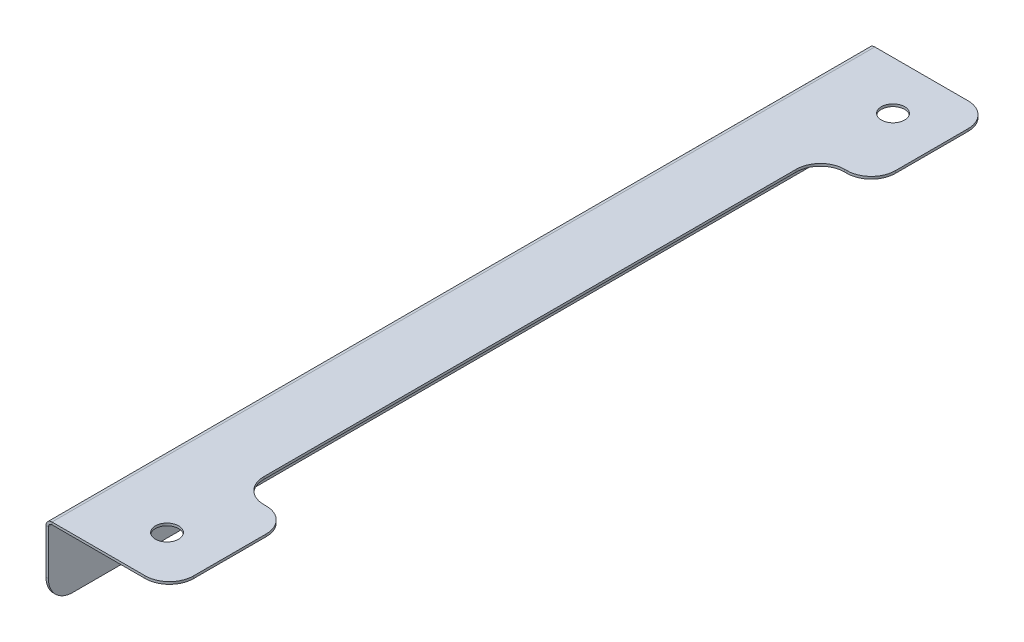
ISO-10303-21;
HEADER;
FILE_DESCRIPTION(('STEP AP214'),'2;1');
FILE_NAME('part.step','',(''),(''),'','','');
FILE_SCHEMA(('AUTOMOTIVE_DESIGN { 1 0 10303 214 1 1 1 1 }'));
ENDSEC;
DATA;
#1=APPLICATION_CONTEXT('core data for automotive mechanical design processes');
#2=APPLICATION_PROTOCOL_DEFINITION('international standard','automotive_design',2000,#1);
#3=PRODUCT_CONTEXT('',#1,'mechanical');
#4=PRODUCT('Part','Part','',(#3));
#5=PRODUCT_RELATED_PRODUCT_CATEGORY('part','',(#4));
#6=PRODUCT_DEFINITION_FORMATION('','',#4);
#7=PRODUCT_DEFINITION_CONTEXT('part definition',#1,'design');
#8=PRODUCT_DEFINITION('design','',#6,#7);
#9=PRODUCT_DEFINITION_SHAPE('','',#8);
#10=(LENGTH_UNIT() NAMED_UNIT(*) SI_UNIT(.MILLI.,.METRE.));
#11=(NAMED_UNIT(*) PLANE_ANGLE_UNIT() SI_UNIT($,.RADIAN.));
#12=(NAMED_UNIT(*) SI_UNIT($,.STERADIAN.) SOLID_ANGLE_UNIT());
#13=UNCERTAINTY_MEASURE_WITH_UNIT(LENGTH_MEASURE(1.E-05),#10,'distance_accuracy_value','');
#14=(GEOMETRIC_REPRESENTATION_CONTEXT(3) GLOBAL_UNCERTAINTY_ASSIGNED_CONTEXT((#13)) GLOBAL_UNIT_ASSIGNED_CONTEXT((#10,
#11,#12)) REPRESENTATION_CONTEXT('',''));
#15=CARTESIAN_POINT('',(0.,0.,0.));
#16=DIRECTION('',(0.,0.,1.));
#17=DIRECTION('',(1.,0.,0.));
#18=AXIS2_PLACEMENT_3D('',#15,#16,#17);
#19=CARTESIAN_POINT('',(25.,8.00000000000009,-85.));
#20=DIRECTION('',(-1.,0.,0.));
#21=DIRECTION('',(0.,-1.,0.));
#22=AXIS2_PLACEMENT_3D('',#19,#20,#21);
#23=PLANE('',#22);
#24=DIRECTION('',(0.,0.,-1.));
#25=VECTOR('',#24,1.);
#26=CARTESIAN_POINT('',(25.,8.00000000000009,-85.));
#27=LINE('',#26,#25);
#28=CARTESIAN_POINT('',(25.,8.00000000000009,80.));
#29=VERTEX_POINT('',#28);
#30=CARTESIAN_POINT('',(25.,8.00000000000009,65.));
#31=VERTEX_POINT('',#30);
#32=EDGE_CURVE('E215',#29,#31,#27,.T.);
#33=ORIENTED_EDGE('',*,*,#32,.F.);
#34=DIRECTION('',(0.,-1.,0.));
#35=VECTOR('',#34,1.);
#36=CARTESIAN_POINT('',(25.,8.00000000000009,80.));
#37=LINE('',#36,#35);
#38=CARTESIAN_POINT('',(25.,7.50000000000009,80.));
#39=VERTEX_POINT('',#38);
#40=EDGE_CURVE('E271',#29,#39,#37,.T.);
#41=ORIENTED_EDGE('',*,*,#40,.T.);
#42=DIRECTION('',(0.,0.,-1.));
#43=VECTOR('',#42,1.);
#44=CARTESIAN_POINT('',(25.,7.50000000000009,-85.));
#45=LINE('',#44,#43);
#46=CARTESIAN_POINT('',(25.,7.50000000000009,65.));
#47=VERTEX_POINT('',#46);
#48=EDGE_CURVE('E217',#39,#47,#45,.T.);
#49=ORIENTED_EDGE('',*,*,#48,.T.);
#50=DIRECTION('',(0.,1.,0.));
#51=VECTOR('',#50,1.);
#52=CARTESIAN_POINT('',(25.,8.00000000000009,65.));
#53=LINE('',#52,#51);
#54=EDGE_CURVE('E268',#47,#31,#53,.T.);
#55=ORIENTED_EDGE('',*,*,#54,.T.);
#56=EDGE_LOOP('',(#33,#41,#49,#55));
#57=FACE_BOUND('',#56,.T.);
#58=ADVANCED_FACE('F37',(#57),#23,.F.);
#59=CARTESIAN_POINT('',(-0.5,-7.5,85.));
#60=DIRECTION('',(0.,0.,1.));
#61=DIRECTION('',(1.,0.,0.));
#62=AXIS2_PLACEMENT_3D('',#59,#60,#61);
#63=PLANE('',#62);
#64=DIRECTION('',(0.,-1.,0.));
#65=VECTOR('',#64,1.);
#66=CARTESIAN_POINT('',(-0.5,-7.5,85.));
#67=LINE('',#66,#65);
#68=CARTESIAN_POINT('',(-0.499999999999997,6.7634,85.));
#69=VERTEX_POINT('',#68);
#70=CARTESIAN_POINT('',(-0.5,-2.5,85.));
#71=VERTEX_POINT('',#70);
#72=EDGE_CURVE('E243',#69,#71,#67,.T.);
#73=ORIENTED_EDGE('',*,*,#72,.T.);
#74=DIRECTION('',(1.,0.,0.));
#75=VECTOR('',#74,1.);
#76=CARTESIAN_POINT('',(-0.5,-2.5,85.));
#77=LINE('',#76,#75);
#78=CARTESIAN_POINT('',(0.,-2.5,85.));
#79=VERTEX_POINT('',#78);
#80=EDGE_CURVE('E320',#71,#79,#77,.T.);
#81=ORIENTED_EDGE('',*,*,#80,.T.);
#82=DIRECTION('',(0.,-1.,0.));
#83=VECTOR('',#82,1.);
#84=CARTESIAN_POINT('',(0.,-7.5,85.));
#85=LINE('',#84,#83);
#86=CARTESIAN_POINT('',(0.,6.7634,85.));
#87=VERTEX_POINT('',#86);
#88=EDGE_CURVE('E252',#87,#79,#85,.T.);
#89=ORIENTED_EDGE('',*,*,#88,.F.);
#90=DIRECTION('',(-1.,0.,0.));
#91=VECTOR('',#90,1.);
#92=CARTESIAN_POINT('',(0.,6.7634,85.));
#93=LINE('',#92,#91);
#94=EDGE_CURVE('E228',#87,#69,#93,.T.);
#95=ORIENTED_EDGE('',*,*,#94,.T.);
#96=EDGE_LOOP('',(#73,#81,#89,#95));
#97=FACE_BOUND('',#96,.T.);
#98=ADVANCED_FACE('F401',(#97),#63,.T.);
#99=CARTESIAN_POINT('',(-0.5,0.,0.));
#100=DIRECTION('',(-1.,0.,0.));
#101=DIRECTION('',(0.,0.,1.));
#102=AXIS2_PLACEMENT_3D('',#99,#100,#101);
#103=PLANE('',#102);
#104=CARTESIAN_POINT('',(-0.5,0.,60.));
#105=DIRECTION('',(1.,0.,0.));
#106=DIRECTION('',(0.,0.,-1.));
#107=AXIS2_PLACEMENT_3D('',#104,#105,#106);
#108=CIRCLE('',#107,2.4);
#109=CARTESIAN_POINT('',(-0.5,0.,57.6));
#110=VERTEX_POINT('',#109);
#111=EDGE_CURVE('E454',#110,#110,#108,.T.);
#112=ORIENTED_EDGE('',*,*,#111,.T.);
#113=EDGE_LOOP('',(#112));
#114=FACE_BOUND('',#113,.T.);
#115=CARTESIAN_POINT('',(-0.5,0.,0.));
#116=DIRECTION('',(1.,0.,0.));
#117=DIRECTION('',(0.,0.,-1.));
#118=AXIS2_PLACEMENT_3D('',#115,#116,#117);
#119=CIRCLE('',#118,2.4);
#120=CARTESIAN_POINT('',(-0.5,0.,-2.4));
#121=VERTEX_POINT('',#120);
#122=EDGE_CURVE('E448',#121,#121,#119,.T.);
#123=ORIENTED_EDGE('',*,*,#122,.T.);
#124=EDGE_LOOP('',(#123));
#125=FACE_BOUND('',#124,.T.);
#126=CARTESIAN_POINT('',(-0.5,0.,-60.));
#127=DIRECTION('',(1.,0.,0.));
#128=DIRECTION('',(0.,0.,-1.));
#129=AXIS2_PLACEMENT_3D('',#126,#127,#128);
#130=CIRCLE('',#129,2.4);
#131=CARTESIAN_POINT('',(-0.5,0.,-62.4));
#132=VERTEX_POINT('',#131);
#133=EDGE_CURVE('E440',#132,#132,#130,.T.);
#134=ORIENTED_EDGE('',*,*,#133,.T.);
#135=EDGE_LOOP('',(#134));
#136=FACE_BOUND('',#135,.T.);
#137=DIRECTION('',(0.,1.,0.));
#138=VECTOR('',#137,1.);
#139=CARTESIAN_POINT('',(-0.5,-7.5,-85.));
#140=LINE('',#139,#138);
#141=CARTESIAN_POINT('',(-0.5,-2.5,-85.));
#142=VERTEX_POINT('',#141);
#143=CARTESIAN_POINT('',(-0.5,6.7634,-85.));
#144=VERTEX_POINT('',#143);
#145=EDGE_CURVE('E241',#142,#144,#140,.T.);
#146=ORIENTED_EDGE('',*,*,#145,.F.);
#147=CARTESIAN_POINT('',(-0.5,-2.5,-80.));
#148=DIRECTION('',(-1.,0.,0.));
#149=DIRECTION('',(0.,0.,1.));
#150=AXIS2_PLACEMENT_3D('',#147,#148,#149);
#151=CIRCLE('',#150,5.);
#152=CARTESIAN_POINT('',(-0.5,-7.5,-80.));
#153=VERTEX_POINT('',#152);
#154=EDGE_CURVE('E318',#142,#153,#151,.T.);
#155=ORIENTED_EDGE('',*,*,#154,.T.);
#156=DIRECTION('',(0.,0.,-1.));
#157=VECTOR('',#156,1.);
#158=CARTESIAN_POINT('',(-0.5,-7.5,85.));
#159=LINE('',#158,#157);
#160=CARTESIAN_POINT('',(-0.5,-7.5,80.));
#161=VERTEX_POINT('',#160);
#162=EDGE_CURVE('E247',#161,#153,#159,.T.);
#163=ORIENTED_EDGE('',*,*,#162,.F.);
#164=CARTESIAN_POINT('',(-0.5,-2.5,80.));
#165=DIRECTION('',(-1.,0.,0.));
#166=DIRECTION('',(0.,0.,1.));
#167=AXIS2_PLACEMENT_3D('',#164,#165,#166);
#168=CIRCLE('',#167,5.);
#169=EDGE_CURVE('E316',#161,#71,#168,.T.);
#170=ORIENTED_EDGE('',*,*,#169,.T.);
#171=ORIENTED_EDGE('',*,*,#72,.F.);
#172=DIRECTION('',(0.,0.,1.));
#173=VECTOR('',#172,1.);
#174=CARTESIAN_POINT('',(-0.499999999999997,6.7634,85.));
#175=LINE('',#174,#173);
#176=EDGE_CURVE('E182',#69,#144,#175,.F.);
#177=ORIENTED_EDGE('',*,*,#176,.T.);
#178=EDGE_LOOP('',(#146,#155,#163,#170,#171,#177));
#179=FACE_BOUND('',#178,.T.);
#180=ADVANCED_FACE('F407',(#114,#125,#136,#179),#103,.T.);
#181=CARTESIAN_POINT('',(0.,0.,0.));
#182=DIRECTION('',(-1.,0.,0.));
#183=DIRECTION('',(0.,0.,1.));
#184=AXIS2_PLACEMENT_3D('',#181,#182,#183);
#185=PLANE('',#184);
#186=CARTESIAN_POINT('',(0.,0.,60.));
#187=DIRECTION('',(1.,0.,0.));
#188=DIRECTION('',(0.,0.,-1.));
#189=AXIS2_PLACEMENT_3D('',#186,#187,#188);
#190=CIRCLE('',#189,2.39999999999999);
#191=CARTESIAN_POINT('',(0.,0.,57.6));
#192=VERTEX_POINT('',#191);
#193=EDGE_CURVE('E457',#192,#192,#190,.T.);
#194=ORIENTED_EDGE('',*,*,#193,.F.);
#195=EDGE_LOOP('',(#194));
#196=FACE_BOUND('',#195,.T.);
#197=CARTESIAN_POINT('',(0.,0.,0.));
#198=DIRECTION('',(1.,0.,0.));
#199=DIRECTION('',(0.,0.,-1.));
#200=AXIS2_PLACEMENT_3D('',#197,#198,#199);
#201=CIRCLE('',#200,2.39999999999999);
#202=CARTESIAN_POINT('',(0.,0.,-2.39999999999999));
#203=VERTEX_POINT('',#202);
#204=EDGE_CURVE('E451',#203,#203,#201,.T.);
#205=ORIENTED_EDGE('',*,*,#204,.F.);
#206=EDGE_LOOP('',(#205));
#207=FACE_BOUND('',#206,.T.);
#208=CARTESIAN_POINT('',(0.,0.,-60.));
#209=DIRECTION('',(1.,0.,0.));
#210=DIRECTION('',(0.,0.,-1.));
#211=AXIS2_PLACEMENT_3D('',#208,#209,#210);
#212=CIRCLE('',#211,2.39999999999999);
#213=CARTESIAN_POINT('',(0.,0.,-62.4));
#214=VERTEX_POINT('',#213);
#215=EDGE_CURVE('E443',#214,#214,#212,.T.);
#216=ORIENTED_EDGE('',*,*,#215,.F.);
#217=EDGE_LOOP('',(#216));
#218=FACE_BOUND('',#217,.T.);
#219=DIRECTION('',(0.,0.,-1.));
#220=VECTOR('',#219,1.);
#221=CARTESIAN_POINT('',(0.,-7.5,85.));
#222=LINE('',#221,#220);
#223=CARTESIAN_POINT('',(0.,-7.5,80.));
#224=VERTEX_POINT('',#223);
#225=CARTESIAN_POINT('',(0.,-7.5,-80.));
#226=VERTEX_POINT('',#225);
#227=EDGE_CURVE('E244',#224,#226,#222,.T.);
#228=ORIENTED_EDGE('',*,*,#227,.T.);
#229=CARTESIAN_POINT('',(0.,-2.5,-80.));
#230=DIRECTION('',(-1.,0.,0.));
#231=DIRECTION('',(0.,0.,1.));
#232=AXIS2_PLACEMENT_3D('',#229,#230,#231);
#233=CIRCLE('',#232,5.);
#234=CARTESIAN_POINT('',(0.,-2.5,-85.));
#235=VERTEX_POINT('',#234);
#236=EDGE_CURVE('E312',#226,#235,#233,.F.);
#237=ORIENTED_EDGE('',*,*,#236,.T.);
#238=DIRECTION('',(0.,1.,0.));
#239=VECTOR('',#238,1.);
#240=CARTESIAN_POINT('',(0.,-7.5,-85.));
#241=LINE('',#240,#239);
#242=CARTESIAN_POINT('',(0.,6.7634,-85.));
#243=VERTEX_POINT('',#242);
#244=EDGE_CURVE('E239',#235,#243,#241,.T.);
#245=ORIENTED_EDGE('',*,*,#244,.T.);
#246=DIRECTION('',(0.,0.,1.));
#247=VECTOR('',#246,1.);
#248=CARTESIAN_POINT('',(0.,6.7634,85.));
#249=LINE('',#248,#247);
#250=EDGE_CURVE('E232',#87,#243,#249,.F.);
#251=ORIENTED_EDGE('',*,*,#250,.F.);
#252=ORIENTED_EDGE('',*,*,#88,.T.);
#253=CARTESIAN_POINT('',(0.,-2.5,80.));
#254=DIRECTION('',(-1.,0.,0.));
#255=DIRECTION('',(0.,0.,1.));
#256=AXIS2_PLACEMENT_3D('',#253,#254,#255);
#257=CIRCLE('',#256,5.);
#258=EDGE_CURVE('E310',#79,#224,#257,.F.);
#259=ORIENTED_EDGE('',*,*,#258,.T.);
#260=EDGE_LOOP('',(#228,#237,#245,#251,#252,#259));
#261=FACE_BOUND('',#260,.T.);
#262=ADVANCED_FACE('F463',(#196,#207,#218,#261),#185,.F.);
#263=CARTESIAN_POINT('',(-0.5,-7.5,-85.));
#264=DIRECTION('',(0.,0.,-1.));
#265=DIRECTION('',(-1.,0.,0.));
#266=AXIS2_PLACEMENT_3D('',#263,#264,#265);
#267=PLANE('',#266);
#268=ORIENTED_EDGE('',*,*,#244,.F.);
#269=DIRECTION('',(1.,0.,0.));
#270=VECTOR('',#269,1.);
#271=CARTESIAN_POINT('',(-0.5,-2.5,-85.));
#272=LINE('',#271,#270);
#273=EDGE_CURVE('E314',#235,#142,#272,.F.);
#274=ORIENTED_EDGE('',*,*,#273,.T.);
#275=ORIENTED_EDGE('',*,*,#145,.T.);
#276=DIRECTION('',(-1.,0.,0.));
#277=VECTOR('',#276,1.);
#278=CARTESIAN_POINT('',(0.,6.7634,-85.));
#279=LINE('',#278,#277);
#280=EDGE_CURVE('E236',#243,#144,#279,.T.);
#281=ORIENTED_EDGE('',*,*,#280,.F.);
#282=EDGE_LOOP('',(#268,#274,#275,#281));
#283=FACE_BOUND('',#282,.T.);
#284=ADVANCED_FACE('F466',(#283),#267,.T.);
#285=CARTESIAN_POINT('',(-0.5,-7.5,85.));
#286=DIRECTION('',(0.,-1.,0.));
#287=DIRECTION('',(0.,0.,-1.));
#288=AXIS2_PLACEMENT_3D('',#285,#286,#287);
#289=PLANE('',#288);
#290=ORIENTED_EDGE('',*,*,#162,.T.);
#291=DIRECTION('',(1.,0.,0.));
#292=VECTOR('',#291,1.);
#293=CARTESIAN_POINT('',(-0.5,-7.5,-80.));
#294=LINE('',#293,#292);
#295=EDGE_CURVE('E307',#153,#226,#294,.T.);
#296=ORIENTED_EDGE('',*,*,#295,.T.);
#297=ORIENTED_EDGE('',*,*,#227,.F.);
#298=DIRECTION('',(1.,0.,0.));
#299=VECTOR('',#298,1.);
#300=CARTESIAN_POINT('',(-0.5,-7.5,80.));
#301=LINE('',#300,#299);
#302=EDGE_CURVE('E305',#224,#161,#301,.F.);
#303=ORIENTED_EDGE('',*,*,#302,.T.);
#304=EDGE_LOOP('',(#290,#296,#297,#303));
#305=FACE_BOUND('',#304,.T.);
#306=ADVANCED_FACE('F476',(#305),#289,.T.);
#307=CARTESIAN_POINT('',(0.736600000000003,6.7634,-85.));
#308=DIRECTION('',(0.,0.,-1.));
#309=DIRECTION('',(-1.,0.,0.));
#310=AXIS2_PLACEMENT_3D('',#307,#308,#309);
#311=PLANE('',#310);
#312=DIRECTION('',(0.,1.,0.));
#313=VECTOR('',#312,1.);
#314=CARTESIAN_POINT('',(0.736599999999998,7.5,-85.));
#315=LINE('',#314,#313);
#316=CARTESIAN_POINT('',(0.7366,7.5,-85.));
#317=VERTEX_POINT('',#316);
#318=CARTESIAN_POINT('',(0.736599999999999,8.,-85.));
#319=VERTEX_POINT('',#318);
#320=EDGE_CURVE('E260',#317,#319,#315,.T.);
#321=ORIENTED_EDGE('',*,*,#320,.F.);
#322=CARTESIAN_POINT('',(0.736600000000003,6.7634,-85.));
#323=DIRECTION('',(0.,0.,1.));
#324=DIRECTION('',(1.,0.,0.));
#325=AXIS2_PLACEMENT_3D('',#322,#323,#324);
#326=CIRCLE('',#325,0.7366);
#327=EDGE_CURVE('E185',#243,#317,#326,.F.);
#328=ORIENTED_EDGE('',*,*,#327,.F.);
#329=ORIENTED_EDGE('',*,*,#280,.T.);
#330=CARTESIAN_POINT('',(0.736600000000003,6.7634,-85.));
#331=DIRECTION('',(0.,0.,1.));
#332=DIRECTION('',(1.,0.,0.));
#333=AXIS2_PLACEMENT_3D('',#330,#331,#332);
#334=CIRCLE('',#333,1.2366);
#335=EDGE_CURVE('E227',#144,#319,#334,.F.);
#336=ORIENTED_EDGE('',*,*,#335,.T.);
#337=EDGE_LOOP('',(#321,#328,#329,#336));
#338=FACE_BOUND('',#337,.T.);
#339=ADVANCED_FACE('F367',(#338),#311,.T.);
#340=CARTESIAN_POINT('',(0.736600000000003,6.7634,85.));
#341=DIRECTION('',(0.,0.,-1.));
#342=DIRECTION('',(-1.,0.,0.));
#343=AXIS2_PLACEMENT_3D('',#340,#341,#342);
#344=PLANE('',#343);
#345=CARTESIAN_POINT('',(0.736600000000003,6.7634,85.));
#346=DIRECTION('',(0.,0.,1.));
#347=DIRECTION('',(1.,0.,0.));
#348=AXIS2_PLACEMENT_3D('',#345,#346,#347);
#349=CIRCLE('',#348,0.7366);
#350=CARTESIAN_POINT('',(0.7366,7.5,85.));
#351=VERTEX_POINT('',#350);
#352=EDGE_CURVE('E192',#351,#87,#349,.T.);
#353=ORIENTED_EDGE('',*,*,#352,.F.);
#354=DIRECTION('',(0.,1.,0.));
#355=VECTOR('',#354,1.);
#356=CARTESIAN_POINT('',(0.736600000000003,7.5,85.));
#357=LINE('',#356,#355);
#358=CARTESIAN_POINT('',(0.736600000000001,8.,85.));
#359=VERTEX_POINT('',#358);
#360=EDGE_CURVE('E189',#351,#359,#357,.T.);
#361=ORIENTED_EDGE('',*,*,#360,.T.);
#362=CARTESIAN_POINT('',(0.736600000000003,6.7634,85.));
#363=DIRECTION('',(0.,0.,1.));
#364=DIRECTION('',(1.,0.,0.));
#365=AXIS2_PLACEMENT_3D('',#362,#363,#364);
#366=CIRCLE('',#365,1.2366);
#367=EDGE_CURVE('E174',#359,#69,#366,.T.);
#368=ORIENTED_EDGE('',*,*,#367,.T.);
#369=ORIENTED_EDGE('',*,*,#94,.F.);
#370=EDGE_LOOP('',(#353,#361,#368,#369));
#371=FACE_BOUND('',#370,.T.);
#372=ADVANCED_FACE('F190',(#371),#344,.F.);
#373=CARTESIAN_POINT('',(0.736600000000003,6.7634,85.));
#374=DIRECTION('',(0.,0.,1.));
#375=DIRECTION('',(0.,1.,0.));
#376=AXIS2_PLACEMENT_3D('',#373,#374,#375);
#377=CYLINDRICAL_SURFACE('',#376,1.2366);
#378=ORIENTED_EDGE('',*,*,#176,.F.);
#379=ORIENTED_EDGE('',*,*,#367,.F.);
#380=DIRECTION('',(0.,0.,-1.));
#381=VECTOR('',#380,1.);
#382=CARTESIAN_POINT('',(0.736599999999999,8.,0.));
#383=LINE('',#382,#381);
#384=EDGE_CURVE('E179',#359,#319,#383,.T.);
#385=ORIENTED_EDGE('',*,*,#384,.T.);
#386=ORIENTED_EDGE('',*,*,#335,.F.);
#387=EDGE_LOOP('',(#378,#379,#385,#386));
#388=FACE_BOUND('',#387,.T.);
#389=ADVANCED_FACE('F176',(#388),#377,.T.);
#390=CARTESIAN_POINT('',(0.736600000000003,6.7634,85.));
#391=DIRECTION('',(0.,0.,1.));
#392=DIRECTION('',(0.,1.,0.));
#393=AXIS2_PLACEMENT_3D('',#390,#391,#392);
#394=CYLINDRICAL_SURFACE('',#393,0.7366);
#395=ORIENTED_EDGE('',*,*,#250,.T.);
#396=ORIENTED_EDGE('',*,*,#327,.T.);
#397=DIRECTION('',(0.,0.,1.));
#398=VECTOR('',#397,1.);
#399=CARTESIAN_POINT('',(0.736599999999998,7.5,-85.));
#400=LINE('',#399,#398);
#401=EDGE_CURVE('E197',#317,#351,#400,.T.);
#402=ORIENTED_EDGE('',*,*,#401,.T.);
#403=ORIENTED_EDGE('',*,*,#352,.T.);
#404=EDGE_LOOP('',(#395,#396,#402,#403));
#405=FACE_BOUND('',#404,.T.);
#406=ADVANCED_FACE('F371',(#405),#394,.F.);
#407=CARTESIAN_POINT('',(25.,8.00000000000009,85.));
#408=DIRECTION('',(0.,0.,-1.));
#409=DIRECTION('',(-1.,0.,0.));
#410=AXIS2_PLACEMENT_3D('',#407,#408,#409);
#411=PLANE('',#410);
#412=DIRECTION('',(1.,0.,0.));
#413=VECTOR('',#412,1.);
#414=CARTESIAN_POINT('',(25.,7.50000000000009,85.));
#415=LINE('',#414,#413);
#416=CARTESIAN_POINT('',(20.,7.50000000000007,85.));
#417=VERTEX_POINT('',#416);
#418=EDGE_CURVE('E206',#351,#417,#415,.T.);
#419=ORIENTED_EDGE('',*,*,#418,.T.);
#420=DIRECTION('',(0.,-1.,0.));
#421=VECTOR('',#420,1.);
#422=CARTESIAN_POINT('',(20.,8.00000000000007,85.));
#423=LINE('',#422,#421);
#424=CARTESIAN_POINT('',(20.,8.00000000000007,85.));
#425=VERTEX_POINT('',#424);
#426=EDGE_CURVE('E210',#417,#425,#423,.F.);
#427=ORIENTED_EDGE('',*,*,#426,.T.);
#428=DIRECTION('',(1.,0.,0.));
#429=VECTOR('',#428,1.);
#430=CARTESIAN_POINT('',(25.,8.00000000000009,85.));
#431=LINE('',#430,#429);
#432=EDGE_CURVE('E202',#359,#425,#431,.T.);
#433=ORIENTED_EDGE('',*,*,#432,.F.);
#434=ORIENTED_EDGE('',*,*,#360,.F.);
#435=EDGE_LOOP('',(#419,#427,#433,#434));
#436=FACE_BOUND('',#435,.T.);
#437=ADVANCED_FACE('F208',(#436),#411,.F.);
#438=CARTESIAN_POINT('',(0.,8.,-85.));
#439=DIRECTION('',(0.,0.,1.));
#440=DIRECTION('',(1.,0.,0.));
#441=AXIS2_PLACEMENT_3D('',#438,#439,#440);
#442=PLANE('',#441);
#443=DIRECTION('',(-1.,0.,0.));
#444=VECTOR('',#443,1.);
#445=CARTESIAN_POINT('',(0.,8.,-85.));
#446=LINE('',#445,#444);
#447=CARTESIAN_POINT('',(20.,8.00000000000007,-85.));
#448=VERTEX_POINT('',#447);
#449=EDGE_CURVE('E205',#448,#319,#446,.T.);
#450=ORIENTED_EDGE('',*,*,#449,.F.);
#451=DIRECTION('',(0.,-1.,0.));
#452=VECTOR('',#451,1.);
#453=CARTESIAN_POINT('',(20.,8.00000000000007,-85.));
#454=LINE('',#453,#452);
#455=CARTESIAN_POINT('',(20.,7.50000000000007,-85.));
#456=VERTEX_POINT('',#455);
#457=EDGE_CURVE('E293',#448,#456,#454,.T.);
#458=ORIENTED_EDGE('',*,*,#457,.T.);
#459=DIRECTION('',(-1.,0.,0.));
#460=VECTOR('',#459,1.);
#461=CARTESIAN_POINT('',(0.,7.5,-85.));
#462=LINE('',#461,#460);
#463=EDGE_CURVE('E212',#456,#317,#462,.T.);
#464=ORIENTED_EDGE('',*,*,#463,.T.);
#465=ORIENTED_EDGE('',*,*,#320,.T.);
#466=EDGE_LOOP('',(#450,#458,#464,#465));
#467=FACE_BOUND('',#466,.T.);
#468=ADVANCED_FACE('F362',(#467),#442,.F.);
#469=CARTESIAN_POINT('',(0.,8.,0.));
#470=DIRECTION('',(0.,-1.,0.));
#471=DIRECTION('',(1.,0.,0.));
#472=AXIS2_PLACEMENT_3D('',#469,#470,#471);
#473=PLANE('',#472);
#474=CARTESIAN_POINT('',(14.5,8.00000000000005,-75.));
#475=DIRECTION('',(0.,1.,0.));
#476=DIRECTION('',(0.,0.,1.));
#477=AXIS2_PLACEMENT_3D('',#474,#475,#476);
#478=CIRCLE('',#477,2.39999999999999);
#479=CARTESIAN_POINT('',(14.5,8.00000000000005,-72.6));
#480=VERTEX_POINT('',#479);
#481=EDGE_CURVE('E265',#480,#480,#478,.T.);
#482=ORIENTED_EDGE('',*,*,#481,.F.);
#483=EDGE_LOOP('',(#482));
#484=FACE_BOUND('',#483,.T.);
#485=CARTESIAN_POINT('',(14.5,8.00000000000005,75.));
#486=DIRECTION('',(0.,1.,0.));
#487=DIRECTION('',(0.,0.,1.));
#488=AXIS2_PLACEMENT_3D('',#485,#486,#487);
#489=CIRCLE('',#488,2.39999999999999);
#490=CARTESIAN_POINT('',(14.5,8.00000000000005,77.4));
#491=VERTEX_POINT('',#490);
#492=EDGE_CURVE('E261',#491,#491,#489,.T.);
#493=ORIENTED_EDGE('',*,*,#492,.F.);
#494=EDGE_LOOP('',(#493));
#495=FACE_BOUND('',#494,.T.);
#496=ORIENTED_EDGE('',*,*,#432,.T.);
#497=CARTESIAN_POINT('',(20.,8.00000000000007,80.));
#498=DIRECTION('',(0.,-1.,0.));
#499=DIRECTION('',(1.,0.,0.));
#500=AXIS2_PLACEMENT_3D('',#497,#498,#499);
#501=CIRCLE('',#500,5.);
#502=EDGE_CURVE('E291',#425,#29,#501,.F.);
#503=ORIENTED_EDGE('',*,*,#502,.T.);
#504=ORIENTED_EDGE('',*,*,#32,.T.);
#505=CARTESIAN_POINT('',(20.,8.00000000000007,65.));
#506=DIRECTION('',(0.,-1.,0.));
#507=DIRECTION('',(1.,0.,0.));
#508=AXIS2_PLACEMENT_3D('',#505,#506,#507);
#509=CIRCLE('',#508,5.);
#510=CARTESIAN_POINT('',(20.,8.00000000000007,60.));
#511=VERTEX_POINT('',#510);
#512=EDGE_CURVE('E284',#31,#511,#509,.F.);
#513=ORIENTED_EDGE('',*,*,#512,.T.);
#514=DIRECTION('',(1.,0.,0.));
#515=VECTOR('',#514,1.);
#516=CARTESIAN_POINT('',(25.,8.00000000000009,60.));
#517=LINE('',#516,#515);
#518=CARTESIAN_POINT('',(19.5,8.00000000000007,60.));
#519=VERTEX_POINT('',#518);
#520=EDGE_CURVE('E339',#519,#511,#517,.T.);
#521=ORIENTED_EDGE('',*,*,#520,.F.);
#522=CARTESIAN_POINT('',(19.5,8.00000000000007,55.));
#523=DIRECTION('',(0.,-1.,0.));
#524=DIRECTION('',(1.,0.,0.));
#525=AXIS2_PLACEMENT_3D('',#522,#523,#524);
#526=CIRCLE('',#525,5.);
#527=CARTESIAN_POINT('',(14.5,8.00000000000005,55.));
#528=VERTEX_POINT('',#527);
#529=EDGE_CURVE('E45',#519,#528,#526,.T.);
#530=ORIENTED_EDGE('',*,*,#529,.T.);
#531=DIRECTION('',(0.,0.,1.));
#532=VECTOR('',#531,1.);
#533=CARTESIAN_POINT('',(14.5,8.00000000000005,-60.));
#534=LINE('',#533,#532);
#535=CARTESIAN_POINT('',(14.5,8.00000000000005,-55.));
#536=VERTEX_POINT('',#535);
#537=EDGE_CURVE('E338',#536,#528,#534,.T.);
#538=ORIENTED_EDGE('',*,*,#537,.F.);
#539=CARTESIAN_POINT('',(19.5,8.00000000000007,-55.));
#540=DIRECTION('',(0.,-1.,0.));
#541=DIRECTION('',(1.,0.,0.));
#542=AXIS2_PLACEMENT_3D('',#539,#540,#541);
#543=CIRCLE('',#542,5.);
#544=CARTESIAN_POINT('',(19.5,8.00000000000007,-60.));
#545=VERTEX_POINT('',#544);
#546=EDGE_CURVE('E332',#536,#545,#543,.T.);
#547=ORIENTED_EDGE('',*,*,#546,.T.);
#548=DIRECTION('',(-1.,0.,0.));
#549=VECTOR('',#548,1.);
#550=CARTESIAN_POINT('',(25.,8.00000000000009,-60.));
#551=LINE('',#550,#549);
#552=CARTESIAN_POINT('',(20.,8.00000000000007,-60.));
#553=VERTEX_POINT('',#552);
#554=EDGE_CURVE('E343',#553,#545,#551,.T.);
#555=ORIENTED_EDGE('',*,*,#554,.F.);
#556=CARTESIAN_POINT('',(20.,8.00000000000007,-65.));
#557=DIRECTION('',(0.,-1.,0.));
#558=DIRECTION('',(1.,0.,0.));
#559=AXIS2_PLACEMENT_3D('',#556,#557,#558);
#560=CIRCLE('',#559,5.);
#561=CARTESIAN_POINT('',(25.,8.00000000000009,-65.));
#562=VERTEX_POINT('',#561);
#563=EDGE_CURVE('E287',#553,#562,#560,.F.);
#564=ORIENTED_EDGE('',*,*,#563,.T.);
#565=CARTESIAN_POINT('',(25.,8.00000000000009,-80.));
#566=VERTEX_POINT('',#565);
#567=EDGE_CURVE('E211',#562,#566,#27,.T.);
#568=ORIENTED_EDGE('',*,*,#567,.T.);
#569=CARTESIAN_POINT('',(20.,8.00000000000007,-80.));
#570=DIRECTION('',(0.,-1.,0.));
#571=DIRECTION('',(1.,0.,0.));
#572=AXIS2_PLACEMENT_3D('',#569,#570,#571);
#573=CIRCLE('',#572,5.);
#574=EDGE_CURVE('E289',#566,#448,#573,.F.);
#575=ORIENTED_EDGE('',*,*,#574,.T.);
#576=ORIENTED_EDGE('',*,*,#449,.T.);
#577=ORIENTED_EDGE('',*,*,#384,.F.);
#578=EDGE_LOOP('',(#496,#503,#504,#513,#521,#530,#538,#547,#555,#564,#568,#575,#576,#577));
#579=FACE_BOUND('',#578,.T.);
#580=ADVANCED_FACE('F201',(#484,#495,#579),#473,.F.);
#581=CARTESIAN_POINT('',(0.,7.5,0.));
#582=DIRECTION('',(0.,-1.,0.));
#583=DIRECTION('',(1.,0.,0.));
#584=AXIS2_PLACEMENT_3D('',#581,#582,#583);
#585=PLANE('',#584);
#586=ORIENTED_EDGE('',*,*,#48,.F.);
#587=CARTESIAN_POINT('',(20.,7.50000000000007,80.));
#588=DIRECTION('',(0.,-1.,0.));
#589=DIRECTION('',(1.,0.,0.));
#590=AXIS2_PLACEMENT_3D('',#587,#588,#589);
#591=CIRCLE('',#590,5.);
#592=EDGE_CURVE('E281',#39,#417,#591,.T.);
#593=ORIENTED_EDGE('',*,*,#592,.T.);
#594=ORIENTED_EDGE('',*,*,#418,.F.);
#595=ORIENTED_EDGE('',*,*,#401,.F.);
#596=ORIENTED_EDGE('',*,*,#463,.F.);
#597=CARTESIAN_POINT('',(20.,7.50000000000007,-80.));
#598=DIRECTION('',(0.,-1.,0.));
#599=DIRECTION('',(1.,0.,0.));
#600=AXIS2_PLACEMENT_3D('',#597,#598,#599);
#601=CIRCLE('',#600,5.);
#602=CARTESIAN_POINT('',(25.,7.50000000000009,-80.));
#603=VERTEX_POINT('',#602);
#604=EDGE_CURVE('E279',#456,#603,#601,.T.);
#605=ORIENTED_EDGE('',*,*,#604,.T.);
#606=CARTESIAN_POINT('',(25.,7.50000000000009,-65.));
#607=VERTEX_POINT('',#606);
#608=EDGE_CURVE('E223',#607,#603,#45,.T.);
#609=ORIENTED_EDGE('',*,*,#608,.F.);
#610=CARTESIAN_POINT('',(20.,7.50000000000007,-65.));
#611=DIRECTION('',(0.,-1.,0.));
#612=DIRECTION('',(1.,0.,0.));
#613=AXIS2_PLACEMENT_3D('',#610,#611,#612);
#614=CIRCLE('',#613,5.);
#615=CARTESIAN_POINT('',(20.,7.50000000000007,-60.));
#616=VERTEX_POINT('',#615);
#617=EDGE_CURVE('E276',#607,#616,#614,.T.);
#618=ORIENTED_EDGE('',*,*,#617,.T.);
#619=DIRECTION('',(1.,0.,0.));
#620=VECTOR('',#619,1.);
#621=CARTESIAN_POINT('',(0.,7.5,-60.));
#622=LINE('',#621,#620);
#623=CARTESIAN_POINT('',(19.5,7.50000000000007,-60.));
#624=VERTEX_POINT('',#623);
#625=EDGE_CURVE('E350',#624,#616,#622,.T.);
#626=ORIENTED_EDGE('',*,*,#625,.F.);
#627=CARTESIAN_POINT('',(19.5,7.50000000000007,-55.));
#628=DIRECTION('',(0.,-1.,0.));
#629=DIRECTION('',(1.,0.,0.));
#630=AXIS2_PLACEMENT_3D('',#627,#628,#629);
#631=CIRCLE('',#630,5.);
#632=CARTESIAN_POINT('',(14.5,7.50000000000005,-55.));
#633=VERTEX_POINT('',#632);
#634=EDGE_CURVE('E334',#624,#633,#631,.F.);
#635=ORIENTED_EDGE('',*,*,#634,.T.);
#636=DIRECTION('',(0.,0.,-1.));
#637=VECTOR('',#636,1.);
#638=CARTESIAN_POINT('',(14.5,7.50000000000005,0.));
#639=LINE('',#638,#637);
#640=CARTESIAN_POINT('',(14.5,7.50000000000005,55.));
#641=VERTEX_POINT('',#640);
#642=EDGE_CURVE('E250',#641,#633,#639,.T.);
#643=ORIENTED_EDGE('',*,*,#642,.F.);
#644=CARTESIAN_POINT('',(19.5,7.50000000000007,55.));
#645=DIRECTION('',(0.,-1.,0.));
#646=DIRECTION('',(1.,0.,0.));
#647=AXIS2_PLACEMENT_3D('',#644,#645,#646);
#648=CIRCLE('',#647,5.);
#649=CARTESIAN_POINT('',(19.5,7.50000000000007,60.));
#650=VERTEX_POINT('',#649);
#651=EDGE_CURVE('E11',#641,#650,#648,.F.);
#652=ORIENTED_EDGE('',*,*,#651,.T.);
#653=DIRECTION('',(-1.,0.,0.));
#654=VECTOR('',#653,1.);
#655=CARTESIAN_POINT('',(0.,7.5,60.));
#656=LINE('',#655,#654);
#657=CARTESIAN_POINT('',(20.,7.50000000000007,60.));
#658=VERTEX_POINT('',#657);
#659=EDGE_CURVE('E347',#658,#650,#656,.T.);
#660=ORIENTED_EDGE('',*,*,#659,.F.);
#661=CARTESIAN_POINT('',(20.,7.50000000000007,65.));
#662=DIRECTION('',(0.,-1.,0.));
#663=DIRECTION('',(1.,0.,0.));
#664=AXIS2_PLACEMENT_3D('',#661,#662,#663);
#665=CIRCLE('',#664,5.);
#666=EDGE_CURVE('E274',#658,#47,#665,.T.);
#667=ORIENTED_EDGE('',*,*,#666,.T.);
#668=EDGE_LOOP('',(#586,#593,#594,#595,#596,#605,#609,#618,#626,#635,#643,#652,#660,#667));
#669=FACE_BOUND('',#668,.T.);
#670=CARTESIAN_POINT('',(14.5,7.50000000000005,-75.));
#671=DIRECTION('',(0.,-1.,0.));
#672=DIRECTION('',(1.,0.,0.));
#673=AXIS2_PLACEMENT_3D('',#670,#671,#672);
#674=CIRCLE('',#673,2.39999999999999);
#675=CARTESIAN_POINT('',(16.9,7.50000000000006,-75.));
#676=VERTEX_POINT('',#675);
#677=EDGE_CURVE('E262',#676,#676,#674,.T.);
#678=ORIENTED_EDGE('',*,*,#677,.F.);
#679=EDGE_LOOP('',(#678));
#680=FACE_BOUND('',#679,.T.);
#681=CARTESIAN_POINT('',(14.5,7.50000000000005,75.));
#682=DIRECTION('',(0.,-1.,0.));
#683=DIRECTION('',(1.,0.,0.));
#684=AXIS2_PLACEMENT_3D('',#681,#682,#683);
#685=CIRCLE('',#684,2.39999999999999);
#686=CARTESIAN_POINT('',(16.9,7.50000000000006,75.));
#687=VERTEX_POINT('',#686);
#688=EDGE_CURVE('E257',#687,#687,#685,.T.);
#689=ORIENTED_EDGE('',*,*,#688,.F.);
#690=EDGE_LOOP('',(#689));
#691=FACE_BOUND('',#690,.T.);
#692=ADVANCED_FACE('F374',(#669,#680,#691),#585,.T.);
#693=ORIENTED_EDGE('',*,*,#608,.T.);
#694=DIRECTION('',(0.,-1.,0.));
#695=VECTOR('',#694,1.);
#696=CARTESIAN_POINT('',(25.,8.00000000000009,-80.));
#697=LINE('',#696,#695);
#698=EDGE_CURVE('E299',#603,#566,#697,.F.);
#699=ORIENTED_EDGE('',*,*,#698,.T.);
#700=ORIENTED_EDGE('',*,*,#567,.F.);
#701=DIRECTION('',(0.,-1.,0.));
#702=VECTOR('',#701,1.);
#703=CARTESIAN_POINT('',(25.,8.00000000000009,-65.));
#704=LINE('',#703,#702);
#705=EDGE_CURVE('E296',#562,#607,#704,.T.);
#706=ORIENTED_EDGE('',*,*,#705,.T.);
#707=EDGE_LOOP('',(#693,#699,#700,#706));
#708=FACE_BOUND('',#707,.T.);
#709=ADVANCED_FACE('F403',(#708),#23,.F.);
#710=CARTESIAN_POINT('',(14.5,8.00000000000005,75.));
#711=DIRECTION('',(0.,1.,0.));
#712=DIRECTION('',(0.,0.,1.));
#713=AXIS2_PLACEMENT_3D('',#710,#711,#712);
#714=CYLINDRICAL_SURFACE('',#713,2.39999999999999);
#715=ORIENTED_EDGE('',*,*,#688,.T.);
#716=EDGE_LOOP('',(#715));
#717=FACE_BOUND('',#716,.T.);
#718=ORIENTED_EDGE('',*,*,#492,.T.);
#719=EDGE_LOOP('',(#718));
#720=FACE_BOUND('',#719,.T.);
#721=ADVANCED_FACE('F413',(#717,#720),#714,.F.);
#722=CARTESIAN_POINT('',(14.5,8.00000000000005,-75.));
#723=DIRECTION('',(0.,1.,0.));
#724=DIRECTION('',(0.,0.,1.));
#725=AXIS2_PLACEMENT_3D('',#722,#723,#724);
#726=CYLINDRICAL_SURFACE('',#725,2.39999999999999);
#727=ORIENTED_EDGE('',*,*,#677,.T.);
#728=EDGE_LOOP('',(#727));
#729=FACE_BOUND('',#728,.T.);
#730=ORIENTED_EDGE('',*,*,#481,.T.);
#731=EDGE_LOOP('',(#730));
#732=FACE_BOUND('',#731,.T.);
#733=ADVANCED_FACE('F419',(#729,#732),#726,.F.);
#734=CARTESIAN_POINT('',(25.0000000000001,-7.5,60.));
#735=DIRECTION('',(0.,0.,1.));
#736=DIRECTION('',(1.,0.,0.));
#737=AXIS2_PLACEMENT_3D('',#734,#735,#736);
#738=PLANE('',#737);
#739=ORIENTED_EDGE('',*,*,#659,.T.);
#740=DIRECTION('',(0.,1.,0.));
#741=VECTOR('',#740,1.);
#742=CARTESIAN_POINT('',(19.5,8.00000000000007,60.));
#743=LINE('',#742,#741);
#744=EDGE_CURVE('E330',#650,#519,#743,.T.);
#745=ORIENTED_EDGE('',*,*,#744,.T.);
#746=ORIENTED_EDGE('',*,*,#520,.T.);
#747=DIRECTION('',(0.,1.,0.));
#748=VECTOR('',#747,1.);
#749=CARTESIAN_POINT('',(20.0000000000001,-7.50000000000002,60.));
#750=LINE('',#749,#748);
#751=EDGE_CURVE('E303',#511,#658,#750,.F.);
#752=ORIENTED_EDGE('',*,*,#751,.T.);
#753=EDGE_LOOP('',(#739,#745,#746,#752));
#754=FACE_BOUND('',#753,.T.);
#755=ADVANCED_FACE('F346',(#754),#738,.F.);
#756=CARTESIAN_POINT('',(14.5,-7.50000000000004,-60.));
#757=DIRECTION('',(-1.,0.,0.));
#758=DIRECTION('',(0.,-1.,0.));
#759=AXIS2_PLACEMENT_3D('',#756,#757,#758);
#760=PLANE('',#759);
#761=ORIENTED_EDGE('',*,*,#642,.T.);
#762=DIRECTION('',(0.,1.,0.));
#763=VECTOR('',#762,1.);
#764=CARTESIAN_POINT('',(14.5,8.00000000000005,-55.));
#765=LINE('',#764,#763);
#766=EDGE_CURVE('E325',#633,#536,#765,.T.);
#767=ORIENTED_EDGE('',*,*,#766,.T.);
#768=ORIENTED_EDGE('',*,*,#537,.T.);
#769=DIRECTION('',(0.,1.,0.));
#770=VECTOR('',#769,1.);
#771=CARTESIAN_POINT('',(14.5,7.50000000000005,55.));
#772=LINE('',#771,#770);
#773=EDGE_CURVE('E323',#528,#641,#772,.F.);
#774=ORIENTED_EDGE('',*,*,#773,.T.);
#775=EDGE_LOOP('',(#761,#767,#768,#774));
#776=FACE_BOUND('',#775,.T.);
#777=ADVANCED_FACE('F341',(#776),#760,.F.);
#778=CARTESIAN_POINT('',(25.,-7.5,-60.));
#779=DIRECTION('',(0.,0.,-1.));
#780=DIRECTION('',(-1.,0.,0.));
#781=AXIS2_PLACEMENT_3D('',#778,#779,#780);
#782=PLANE('',#781);
#783=ORIENTED_EDGE('',*,*,#554,.T.);
#784=DIRECTION('',(0.,1.,0.));
#785=VECTOR('',#784,1.);
#786=CARTESIAN_POINT('',(19.5,7.50000000000009,-60.));
#787=LINE('',#786,#785);
#788=EDGE_CURVE('E328',#545,#624,#787,.F.);
#789=ORIENTED_EDGE('',*,*,#788,.T.);
#790=ORIENTED_EDGE('',*,*,#625,.T.);
#791=DIRECTION('',(0.,-1.,0.));
#792=VECTOR('',#791,1.);
#793=CARTESIAN_POINT('',(20.0000000000001,-7.50000000000002,-60.));
#794=LINE('',#793,#792);
#795=EDGE_CURVE('E301',#616,#553,#794,.F.);
#796=ORIENTED_EDGE('',*,*,#795,.T.);
#797=EDGE_LOOP('',(#783,#789,#790,#796));
#798=FACE_BOUND('',#797,.T.);
#799=ADVANCED_FACE('F439',(#798),#782,.F.);
#800=CARTESIAN_POINT('',(20.,8.00000000000007,80.));
#801=DIRECTION('',(0.,-1.,0.));
#802=DIRECTION('',(1.,0.,0.));
#803=AXIS2_PLACEMENT_3D('',#800,#801,#802);
#804=CYLINDRICAL_SURFACE('',#803,5.);
#805=ORIENTED_EDGE('',*,*,#502,.F.);
#806=ORIENTED_EDGE('',*,*,#426,.F.);
#807=ORIENTED_EDGE('',*,*,#592,.F.);
#808=ORIENTED_EDGE('',*,*,#40,.F.);
#809=EDGE_LOOP('',(#805,#806,#807,#808));
#810=FACE_BOUND('',#809,.T.);
#811=ADVANCED_FACE('F377',(#810),#804,.T.);
#812=CARTESIAN_POINT('',(20.,8.00000000000007,-80.));
#813=DIRECTION('',(0.,-1.,0.));
#814=DIRECTION('',(1.,0.,0.));
#815=AXIS2_PLACEMENT_3D('',#812,#813,#814);
#816=CYLINDRICAL_SURFACE('',#815,5.);
#817=ORIENTED_EDGE('',*,*,#574,.F.);
#818=ORIENTED_EDGE('',*,*,#698,.F.);
#819=ORIENTED_EDGE('',*,*,#604,.F.);
#820=ORIENTED_EDGE('',*,*,#457,.F.);
#821=EDGE_LOOP('',(#817,#818,#819,#820));
#822=FACE_BOUND('',#821,.T.);
#823=ADVANCED_FACE('F397',(#822),#816,.T.);
#824=CARTESIAN_POINT('',(20.,8.00000000000007,-65.));
#825=DIRECTION('',(0.,-1.,0.));
#826=DIRECTION('',(1.,0.,0.));
#827=AXIS2_PLACEMENT_3D('',#824,#825,#826);
#828=CYLINDRICAL_SURFACE('',#827,5.);
#829=ORIENTED_EDGE('',*,*,#563,.F.);
#830=ORIENTED_EDGE('',*,*,#795,.F.);
#831=ORIENTED_EDGE('',*,*,#617,.F.);
#832=ORIENTED_EDGE('',*,*,#705,.F.);
#833=EDGE_LOOP('',(#829,#830,#831,#832));
#834=FACE_BOUND('',#833,.T.);
#835=ADVANCED_FACE('F388',(#834),#828,.T.);
#836=CARTESIAN_POINT('',(20.,8.00000000000007,65.));
#837=DIRECTION('',(0.,1.,0.));
#838=DIRECTION('',(-1.,0.,0.));
#839=AXIS2_PLACEMENT_3D('',#836,#837,#838);
#840=CYLINDRICAL_SURFACE('',#839,5.);
#841=ORIENTED_EDGE('',*,*,#666,.F.);
#842=ORIENTED_EDGE('',*,*,#751,.F.);
#843=ORIENTED_EDGE('',*,*,#512,.F.);
#844=ORIENTED_EDGE('',*,*,#54,.F.);
#845=EDGE_LOOP('',(#841,#842,#843,#844));
#846=FACE_BOUND('',#845,.T.);
#847=ADVANCED_FACE('F385',(#846),#840,.T.);
#848=CARTESIAN_POINT('',(-0.5,-2.5,-80.));
#849=DIRECTION('',(1.,0.,0.));
#850=DIRECTION('',(0.,0.,-1.));
#851=AXIS2_PLACEMENT_3D('',#848,#849,#850);
#852=CYLINDRICAL_SURFACE('',#851,5.);
#853=ORIENTED_EDGE('',*,*,#154,.F.);
#854=ORIENTED_EDGE('',*,*,#273,.F.);
#855=ORIENTED_EDGE('',*,*,#236,.F.);
#856=ORIENTED_EDGE('',*,*,#295,.F.);
#857=EDGE_LOOP('',(#853,#854,#855,#856));
#858=FACE_BOUND('',#857,.T.);
#859=ADVANCED_FACE('F387',(#858),#852,.T.);
#860=CARTESIAN_POINT('',(-0.5,-2.5,80.));
#861=DIRECTION('',(1.,0.,0.));
#862=DIRECTION('',(0.,0.,-1.));
#863=AXIS2_PLACEMENT_3D('',#860,#861,#862);
#864=CYLINDRICAL_SURFACE('',#863,5.);
#865=ORIENTED_EDGE('',*,*,#169,.F.);
#866=ORIENTED_EDGE('',*,*,#302,.F.);
#867=ORIENTED_EDGE('',*,*,#258,.F.);
#868=ORIENTED_EDGE('',*,*,#80,.F.);
#869=EDGE_LOOP('',(#865,#866,#867,#868));
#870=FACE_BOUND('',#869,.T.);
#871=ADVANCED_FACE('F394',(#870),#864,.T.);
#872=CARTESIAN_POINT('',(19.5,-7.50000000000002,-55.));
#873=DIRECTION('',(0.,-1.,0.));
#874=DIRECTION('',(1.,0.,0.));
#875=AXIS2_PLACEMENT_3D('',#872,#873,#874);
#876=CYLINDRICAL_SURFACE('',#875,5.);
#877=ORIENTED_EDGE('',*,*,#634,.F.);
#878=ORIENTED_EDGE('',*,*,#788,.F.);
#879=ORIENTED_EDGE('',*,*,#546,.F.);
#880=ORIENTED_EDGE('',*,*,#766,.F.);
#881=EDGE_LOOP('',(#877,#878,#879,#880));
#882=FACE_BOUND('',#881,.T.);
#883=ADVANCED_FACE('F437',(#882),#876,.F.);
#884=CARTESIAN_POINT('',(19.5000000000001,-7.50000000000002,55.));
#885=DIRECTION('',(0.,-1.,0.));
#886=DIRECTION('',(1.,0.,0.));
#887=AXIS2_PLACEMENT_3D('',#884,#885,#886);
#888=CYLINDRICAL_SURFACE('',#887,5.);
#889=ORIENTED_EDGE('',*,*,#651,.F.);
#890=ORIENTED_EDGE('',*,*,#773,.F.);
#891=ORIENTED_EDGE('',*,*,#529,.F.);
#892=ORIENTED_EDGE('',*,*,#744,.F.);
#893=EDGE_LOOP('',(#889,#890,#891,#892));
#894=FACE_BOUND('',#893,.T.);
#895=ADVANCED_FACE('F39',(#894),#888,.F.);
#896=CARTESIAN_POINT('',(0.,0.,-60.));
#897=DIRECTION('',(1.,0.,0.));
#898=DIRECTION('',(0.,0.,-1.));
#899=AXIS2_PLACEMENT_3D('',#896,#897,#898);
#900=CYLINDRICAL_SURFACE('',#899,2.39999999999999);
#901=ORIENTED_EDGE('',*,*,#133,.F.);
#902=EDGE_LOOP('',(#901));
#903=FACE_BOUND('',#902,.T.);
#904=ORIENTED_EDGE('',*,*,#215,.T.);
#905=EDGE_LOOP('',(#904));
#906=FACE_BOUND('',#905,.T.);
#907=ADVANCED_FACE('F596',(#903,#906),#900,.F.);
#908=CARTESIAN_POINT('',(0.,0.,0.));
#909=DIRECTION('',(1.,0.,0.));
#910=DIRECTION('',(0.,0.,-1.));
#911=AXIS2_PLACEMENT_3D('',#908,#909,#910);
#912=CYLINDRICAL_SURFACE('',#911,2.39999999999999);
#913=ORIENTED_EDGE('',*,*,#122,.F.);
#914=EDGE_LOOP('',(#913));
#915=FACE_BOUND('',#914,.T.);
#916=ORIENTED_EDGE('',*,*,#204,.T.);
#917=EDGE_LOOP('',(#916));
#918=FACE_BOUND('',#917,.T.);
#919=ADVANCED_FACE('F622',(#915,#918),#912,.F.);
#920=CARTESIAN_POINT('',(0.,0.,60.));
#921=DIRECTION('',(1.,0.,0.));
#922=DIRECTION('',(0.,0.,-1.));
#923=AXIS2_PLACEMENT_3D('',#920,#921,#922);
#924=CYLINDRICAL_SURFACE('',#923,2.39999999999999);
#925=ORIENTED_EDGE('',*,*,#111,.F.);
#926=EDGE_LOOP('',(#925));
#927=FACE_BOUND('',#926,.T.);
#928=ORIENTED_EDGE('',*,*,#193,.T.);
#929=EDGE_LOOP('',(#928));
#930=FACE_BOUND('',#929,.T.);
#931=ADVANCED_FACE('F461',(#927,#930),#924,.F.);
#932=CLOSED_SHELL('',(#58,#98,#180,#262,#284,#306,#339,#372,#389,#406,#437,#468,#580,#692,#709,
#721,#733,#755,#777,#799,#811,#823,#835,#847,#859,#871,#883,#895,#907,#919,#931));
#933=MANIFOLD_SOLID_BREP('B2',#932);
#934=ADVANCED_BREP_SHAPE_REPRESENTATION('',(#18,#933),#14);
#935=SHAPE_DEFINITION_REPRESENTATION(#9,#934);
ENDSEC;
END-ISO-10303-21;
